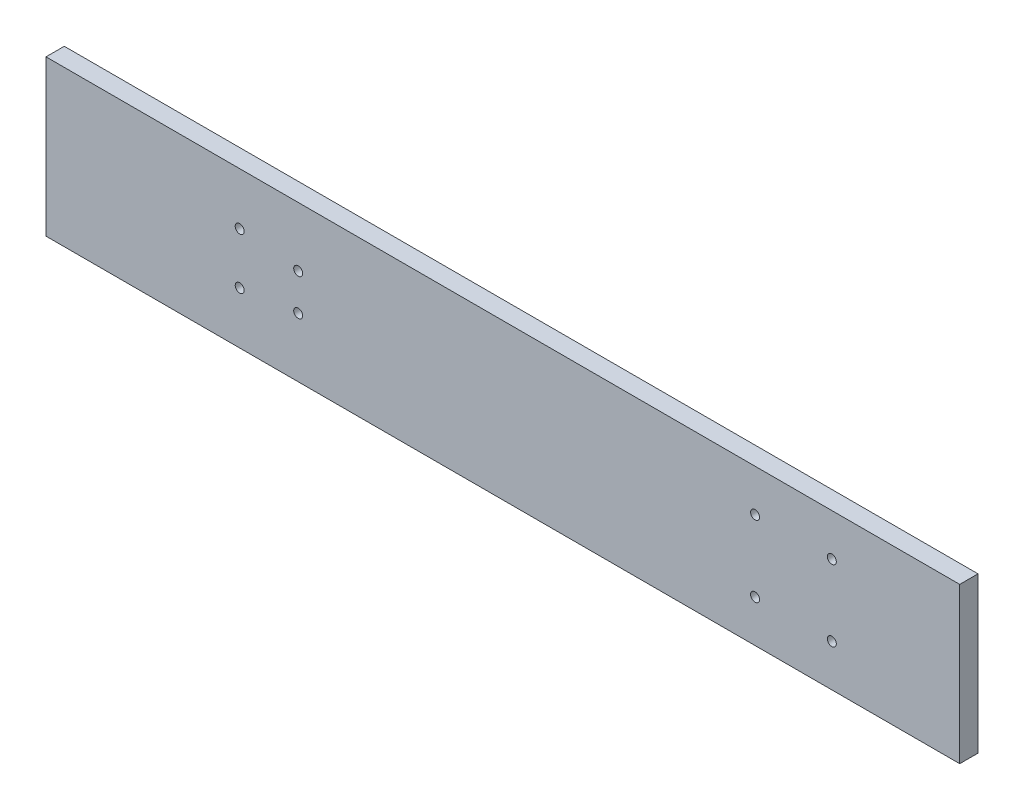
ISO-10303-21;
HEADER;
FILE_DESCRIPTION(('STEP AP214'),'2;1');
FILE_NAME('part.step','',(''),(''),'','','');
FILE_SCHEMA(('AUTOMOTIVE_DESIGN { 1 0 10303 214 1 1 1 1 }'));
ENDSEC;
DATA;
#1=APPLICATION_CONTEXT('core data for automotive mechanical design processes');
#2=APPLICATION_PROTOCOL_DEFINITION('international standard','automotive_design',2000,#1);
#3=PRODUCT_CONTEXT('',#1,'mechanical');
#4=PRODUCT('Part','Part','',(#3));
#5=PRODUCT_RELATED_PRODUCT_CATEGORY('part','',(#4));
#6=PRODUCT_DEFINITION_FORMATION('','',#4);
#7=PRODUCT_DEFINITION_CONTEXT('part definition',#1,'design');
#8=PRODUCT_DEFINITION('design','',#6,#7);
#9=PRODUCT_DEFINITION_SHAPE('','',#8);
#10=(LENGTH_UNIT() NAMED_UNIT(*) SI_UNIT(.MILLI.,.METRE.));
#11=(NAMED_UNIT(*) PLANE_ANGLE_UNIT() SI_UNIT($,.RADIAN.));
#12=(NAMED_UNIT(*) SI_UNIT($,.STERADIAN.) SOLID_ANGLE_UNIT());
#13=UNCERTAINTY_MEASURE_WITH_UNIT(LENGTH_MEASURE(1.E-05),#10,'distance_accuracy_value','');
#14=(GEOMETRIC_REPRESENTATION_CONTEXT(3) GLOBAL_UNCERTAINTY_ASSIGNED_CONTEXT((#13)) GLOBAL_UNIT_ASSIGNED_CONTEXT((#10,
#11,#12)) REPRESENTATION_CONTEXT('',''));
#15=CARTESIAN_POINT('',(0.,0.,0.));
#16=DIRECTION('',(0.,0.,1.));
#17=DIRECTION('',(1.,0.,0.));
#18=AXIS2_PLACEMENT_3D('',#15,#16,#17);
#19=CARTESIAN_POINT('',(250.,42.5,10.));
#20=DIRECTION('',(-1.,0.,0.));
#21=DIRECTION('',(0.,0.,1.));
#22=AXIS2_PLACEMENT_3D('',#19,#20,#21);
#23=PLANE('',#22);
#24=DIRECTION('',(0.,1.,0.));
#25=VECTOR('',#24,1.);
#26=CARTESIAN_POINT('',(250.,42.5,0.));
#27=LINE('',#26,#25);
#28=CARTESIAN_POINT('',(250.,-42.5,0.));
#29=VERTEX_POINT('',#28);
#30=CARTESIAN_POINT('',(250.,42.5,0.));
#31=VERTEX_POINT('',#30);
#32=EDGE_CURVE('E192',#29,#31,#27,.T.);
#33=ORIENTED_EDGE('',*,*,#32,.T.);
#34=DIRECTION('',(0.,0.,-1.));
#35=VECTOR('',#34,1.);
#36=CARTESIAN_POINT('',(250.,42.5,10.));
#37=LINE('',#36,#35);
#38=CARTESIAN_POINT('',(250.,42.5,10.));
#39=VERTEX_POINT('',#38);
#40=EDGE_CURVE('E11',#39,#31,#37,.T.);
#41=ORIENTED_EDGE('',*,*,#40,.F.);
#42=DIRECTION('',(0.,1.,0.));
#43=VECTOR('',#42,1.);
#44=CARTESIAN_POINT('',(250.,42.5,10.));
#45=LINE('',#44,#43);
#46=CARTESIAN_POINT('',(250.,-42.5,10.));
#47=VERTEX_POINT('',#46);
#48=EDGE_CURVE('E193',#47,#39,#45,.T.);
#49=ORIENTED_EDGE('',*,*,#48,.F.);
#50=DIRECTION('',(0.,0.,-1.));
#51=VECTOR('',#50,1.);
#52=CARTESIAN_POINT('',(250.,-42.5,10.));
#53=LINE('',#52,#51);
#54=EDGE_CURVE('E203',#47,#29,#53,.T.);
#55=ORIENTED_EDGE('',*,*,#54,.T.);
#56=EDGE_LOOP('',(#33,#41,#49,#55));
#57=FACE_BOUND('',#56,.T.);
#58=ADVANCED_FACE('F45',(#57),#23,.F.);
#59=CARTESIAN_POINT('',(-250.,42.5,10.));
#60=DIRECTION('',(0.,-1.,0.));
#61=DIRECTION('',(0.,0.,-1.));
#62=AXIS2_PLACEMENT_3D('',#59,#60,#61);
#63=PLANE('',#62);
#64=DIRECTION('',(-1.,0.,0.));
#65=VECTOR('',#64,1.);
#66=CARTESIAN_POINT('',(-250.,42.5,0.));
#67=LINE('',#66,#65);
#68=CARTESIAN_POINT('',(-250.,42.5,0.));
#69=VERTEX_POINT('',#68);
#70=EDGE_CURVE('E207',#31,#69,#67,.T.);
#71=ORIENTED_EDGE('',*,*,#70,.T.);
#72=DIRECTION('',(0.,0.,-1.));
#73=VECTOR('',#72,1.);
#74=CARTESIAN_POINT('',(-250.,42.5,10.));
#75=LINE('',#74,#73);
#76=CARTESIAN_POINT('',(-250.,42.5,10.));
#77=VERTEX_POINT('',#76);
#78=EDGE_CURVE('E54',#77,#69,#75,.T.);
#79=ORIENTED_EDGE('',*,*,#78,.F.);
#80=DIRECTION('',(-1.,0.,0.));
#81=VECTOR('',#80,1.);
#82=CARTESIAN_POINT('',(-250.,42.5,10.));
#83=LINE('',#82,#81);
#84=EDGE_CURVE('E93',#39,#77,#83,.T.);
#85=ORIENTED_EDGE('',*,*,#84,.F.);
#86=ORIENTED_EDGE('',*,*,#40,.T.);
#87=EDGE_LOOP('',(#71,#79,#85,#86));
#88=FACE_BOUND('',#87,.T.);
#89=ADVANCED_FACE('F239',(#88),#63,.F.);
#90=CARTESIAN_POINT('',(-250.,42.5,10.));
#91=DIRECTION('',(1.,0.,0.));
#92=DIRECTION('',(0.,1.,0.));
#93=AXIS2_PLACEMENT_3D('',#90,#91,#92);
#94=PLANE('',#93);
#95=DIRECTION('',(0.,-1.,0.));
#96=VECTOR('',#95,1.);
#97=CARTESIAN_POINT('',(-250.,42.5,0.));
#98=LINE('',#97,#96);
#99=CARTESIAN_POINT('',(-250.,-42.5,0.));
#100=VERTEX_POINT('',#99);
#101=EDGE_CURVE('E80',#69,#100,#98,.T.);
#102=ORIENTED_EDGE('',*,*,#101,.T.);
#103=DIRECTION('',(0.,0.,-1.));
#104=VECTOR('',#103,1.);
#105=CARTESIAN_POINT('',(-250.,-42.5,10.));
#106=LINE('',#105,#104);
#107=CARTESIAN_POINT('',(-250.,-42.5,10.));
#108=VERTEX_POINT('',#107);
#109=EDGE_CURVE('E216',#108,#100,#106,.T.);
#110=ORIENTED_EDGE('',*,*,#109,.F.);
#111=DIRECTION('',(0.,-1.,0.));
#112=VECTOR('',#111,1.);
#113=CARTESIAN_POINT('',(-250.,42.5,10.));
#114=LINE('',#113,#112);
#115=EDGE_CURVE('E198',#77,#108,#114,.T.);
#116=ORIENTED_EDGE('',*,*,#115,.F.);
#117=ORIENTED_EDGE('',*,*,#78,.T.);
#118=EDGE_LOOP('',(#102,#110,#116,#117));
#119=FACE_BOUND('',#118,.T.);
#120=ADVANCED_FACE('F221',(#119),#94,.F.);
#121=CARTESIAN_POINT('',(-250.,-42.5,10.));
#122=DIRECTION('',(0.,1.,0.));
#123=DIRECTION('',(0.,0.,1.));
#124=AXIS2_PLACEMENT_3D('',#121,#122,#123);
#125=PLANE('',#124);
#126=DIRECTION('',(1.,0.,0.));
#127=VECTOR('',#126,1.);
#128=CARTESIAN_POINT('',(-250.,-42.5,0.));
#129=LINE('',#128,#127);
#130=EDGE_CURVE('E86',#100,#29,#129,.T.);
#131=ORIENTED_EDGE('',*,*,#130,.T.);
#132=ORIENTED_EDGE('',*,*,#54,.F.);
#133=DIRECTION('',(1.,0.,0.));
#134=VECTOR('',#133,1.);
#135=CARTESIAN_POINT('',(-250.,-42.5,10.));
#136=LINE('',#135,#134);
#137=EDGE_CURVE('E62',#108,#47,#136,.T.);
#138=ORIENTED_EDGE('',*,*,#137,.F.);
#139=ORIENTED_EDGE('',*,*,#109,.T.);
#140=EDGE_LOOP('',(#131,#132,#138,#139));
#141=FACE_BOUND('',#140,.T.);
#142=ADVANCED_FACE('F228',(#141),#125,.F.);
#143=CARTESIAN_POINT('',(0.,0.,10.));
#144=DIRECTION('',(0.,0.,1.));
#145=DIRECTION('',(1.,0.,0.));
#146=AXIS2_PLACEMENT_3D('',#143,#144,#145);
#147=PLANE('',#146);
#148=CARTESIAN_POINT('',(-144.,14.,10.));
#149=DIRECTION('',(0.,0.,1.));
#150=DIRECTION('',(1.,0.,0.));
#151=AXIS2_PLACEMENT_3D('',#148,#149,#150);
#152=CIRCLE('',#151,2.45745);
#153=CARTESIAN_POINT('',(-141.54255,14.,10.));
#154=VERTEX_POINT('',#153);
#155=EDGE_CURVE('E130',#154,#154,#152,.T.);
#156=ORIENTED_EDGE('',*,*,#155,.F.);
#157=EDGE_LOOP('',(#156));
#158=FACE_BOUND('',#157,.T.);
#159=CARTESIAN_POINT('',(-112.,10.,10.));
#160=DIRECTION('',(0.,0.,1.));
#161=DIRECTION('',(1.,0.,0.));
#162=AXIS2_PLACEMENT_3D('',#159,#160,#161);
#163=CIRCLE('',#162,2.45744999999999);
#164=CARTESIAN_POINT('',(-109.54255,10.,10.));
#165=VERTEX_POINT('',#164);
#166=EDGE_CURVE('E129',#165,#165,#163,.T.);
#167=ORIENTED_EDGE('',*,*,#166,.F.);
#168=EDGE_LOOP('',(#167));
#169=FACE_BOUND('',#168,.T.);
#170=CARTESIAN_POINT('',(-112.,-10.,10.));
#171=DIRECTION('',(0.,0.,1.));
#172=DIRECTION('',(1.,0.,0.));
#173=AXIS2_PLACEMENT_3D('',#170,#171,#172);
#174=CIRCLE('',#173,2.45744999999999);
#175=CARTESIAN_POINT('',(-109.54255,-10.,10.));
#176=VERTEX_POINT('',#175);
#177=EDGE_CURVE('E144',#176,#176,#174,.T.);
#178=ORIENTED_EDGE('',*,*,#177,.F.);
#179=EDGE_LOOP('',(#178));
#180=FACE_BOUND('',#179,.T.);
#181=CARTESIAN_POINT('',(-144.,-14.,10.));
#182=DIRECTION('',(0.,0.,1.));
#183=DIRECTION('',(1.,0.,0.));
#184=AXIS2_PLACEMENT_3D('',#181,#182,#183);
#185=CIRCLE('',#184,2.45745);
#186=CARTESIAN_POINT('',(-141.54255,-14.,10.));
#187=VERTEX_POINT('',#186);
#188=EDGE_CURVE('E152',#187,#187,#185,.T.);
#189=ORIENTED_EDGE('',*,*,#188,.F.);
#190=EDGE_LOOP('',(#189));
#191=FACE_BOUND('',#190,.T.);
#192=CARTESIAN_POINT('',(180.,19.5,10.));
#193=DIRECTION('',(0.,0.,1.));
#194=DIRECTION('',(1.,0.,0.));
#195=AXIS2_PLACEMENT_3D('',#192,#193,#194);
#196=CIRCLE('',#195,2.45745);
#197=CARTESIAN_POINT('',(182.45745,19.5,10.));
#198=VERTEX_POINT('',#197);
#199=EDGE_CURVE('E160',#198,#198,#196,.T.);
#200=ORIENTED_EDGE('',*,*,#199,.F.);
#201=EDGE_LOOP('',(#200));
#202=FACE_BOUND('',#201,.T.);
#203=CARTESIAN_POINT('',(180.,-19.5,10.));
#204=DIRECTION('',(0.,0.,1.));
#205=DIRECTION('',(1.,0.,0.));
#206=AXIS2_PLACEMENT_3D('',#203,#204,#205);
#207=CIRCLE('',#206,2.45745);
#208=CARTESIAN_POINT('',(182.45745,-19.5,10.));
#209=VERTEX_POINT('',#208);
#210=EDGE_CURVE('E168',#209,#209,#207,.T.);
#211=ORIENTED_EDGE('',*,*,#210,.F.);
#212=EDGE_LOOP('',(#211));
#213=FACE_BOUND('',#212,.T.);
#214=CARTESIAN_POINT('',(138.,-19.5,10.));
#215=DIRECTION('',(0.,0.,1.));
#216=DIRECTION('',(1.,0.,0.));
#217=AXIS2_PLACEMENT_3D('',#214,#215,#216);
#218=CIRCLE('',#217,2.45745);
#219=CARTESIAN_POINT('',(140.45745,-19.5,10.));
#220=VERTEX_POINT('',#219);
#221=EDGE_CURVE('E176',#220,#220,#218,.T.);
#222=ORIENTED_EDGE('',*,*,#221,.F.);
#223=EDGE_LOOP('',(#222));
#224=FACE_BOUND('',#223,.T.);
#225=CARTESIAN_POINT('',(138.,19.5,10.));
#226=DIRECTION('',(0.,0.,1.));
#227=DIRECTION('',(1.,0.,0.));
#228=AXIS2_PLACEMENT_3D('',#225,#226,#227);
#229=CIRCLE('',#228,2.45745);
#230=CARTESIAN_POINT('',(140.45745,19.5,10.));
#231=VERTEX_POINT('',#230);
#232=EDGE_CURVE('E184',#231,#231,#229,.T.);
#233=ORIENTED_EDGE('',*,*,#232,.F.);
#234=EDGE_LOOP('',(#233));
#235=FACE_BOUND('',#234,.T.);
#236=ORIENTED_EDGE('',*,*,#48,.T.);
#237=ORIENTED_EDGE('',*,*,#84,.T.);
#238=ORIENTED_EDGE('',*,*,#115,.T.);
#239=ORIENTED_EDGE('',*,*,#137,.T.);
#240=EDGE_LOOP('',(#236,#237,#238,#239));
#241=FACE_BOUND('',#240,.T.);
#242=ADVANCED_FACE('F230',(#158,#169,#180,#191,#202,#213,#224,#235,#241),#147,.T.);
#243=CARTESIAN_POINT('',(0.,0.,0.));
#244=DIRECTION('',(0.,0.,1.));
#245=DIRECTION('',(1.,0.,0.));
#246=AXIS2_PLACEMENT_3D('',#243,#244,#245);
#247=PLANE('',#246);
#248=ORIENTED_EDGE('',*,*,#32,.F.);
#249=ORIENTED_EDGE('',*,*,#130,.F.);
#250=ORIENTED_EDGE('',*,*,#101,.F.);
#251=ORIENTED_EDGE('',*,*,#70,.F.);
#252=EDGE_LOOP('',(#248,#249,#250,#251));
#253=FACE_BOUND('',#252,.T.);
#254=ADVANCED_FACE('F224',(#253),#247,.F.);
#255=CARTESIAN_POINT('',(138.,19.5,5.));
#256=DIRECTION('',(0.,0.,1.));
#257=DIRECTION('',(1.,0.,0.));
#258=AXIS2_PLACEMENT_3D('',#255,#256,#257);
#259=CONICAL_SURFACE('',#258,2.45745,1.02974425867665);
#260=CARTESIAN_POINT('',(138.,19.5,3.52341507177072));
#261=VERTEX_POINT('',#260);
#262=VERTEX_LOOP('',#261);
#263=FACE_BOUND('',#262,.T.);
#264=CARTESIAN_POINT('',(138.,19.5,5.));
#265=DIRECTION('',(0.,0.,1.));
#266=DIRECTION('',(1.,0.,0.));
#267=AXIS2_PLACEMENT_3D('',#264,#265,#266);
#268=CIRCLE('',#267,2.45745);
#269=CARTESIAN_POINT('',(140.45745,19.5,5.));
#270=VERTEX_POINT('',#269);
#271=EDGE_CURVE('E188',#270,#270,#268,.T.);
#272=ORIENTED_EDGE('',*,*,#271,.T.);
#273=EDGE_LOOP('',(#272));
#274=FACE_BOUND('',#273,.T.);
#275=ADVANCED_FACE('F274',(#263,#274),#259,.F.);
#276=CARTESIAN_POINT('',(138.,19.5,10.));
#277=DIRECTION('',(0.,0.,1.));
#278=DIRECTION('',(1.,0.,0.));
#279=AXIS2_PLACEMENT_3D('',#276,#277,#278);
#280=CYLINDRICAL_SURFACE('',#279,2.45745);
#281=ORIENTED_EDGE('',*,*,#271,.F.);
#282=EDGE_LOOP('',(#281));
#283=FACE_BOUND('',#282,.T.);
#284=ORIENTED_EDGE('',*,*,#232,.T.);
#285=EDGE_LOOP('',(#284));
#286=FACE_BOUND('',#285,.T.);
#287=ADVANCED_FACE('F282',(#283,#286),#280,.F.);
#288=CARTESIAN_POINT('',(138.,-19.5,5.));
#289=DIRECTION('',(0.,0.,1.));
#290=DIRECTION('',(1.,0.,0.));
#291=AXIS2_PLACEMENT_3D('',#288,#289,#290);
#292=CONICAL_SURFACE('',#291,2.45745,1.02974425867665);
#293=CARTESIAN_POINT('',(138.,-19.5,3.52341507177072));
#294=VERTEX_POINT('',#293);
#295=VERTEX_LOOP('',#294);
#296=FACE_BOUND('',#295,.T.);
#297=CARTESIAN_POINT('',(138.,-19.5,5.));
#298=DIRECTION('',(0.,0.,1.));
#299=DIRECTION('',(1.,0.,0.));
#300=AXIS2_PLACEMENT_3D('',#297,#298,#299);
#301=CIRCLE('',#300,2.45745);
#302=CARTESIAN_POINT('',(140.45745,-19.5,5.));
#303=VERTEX_POINT('',#302);
#304=EDGE_CURVE('E180',#303,#303,#301,.T.);
#305=ORIENTED_EDGE('',*,*,#304,.T.);
#306=EDGE_LOOP('',(#305));
#307=FACE_BOUND('',#306,.T.);
#308=ADVANCED_FACE('F292',(#296,#307),#292,.F.);
#309=CARTESIAN_POINT('',(138.,-19.5,10.));
#310=DIRECTION('',(0.,0.,1.));
#311=DIRECTION('',(1.,0.,0.));
#312=AXIS2_PLACEMENT_3D('',#309,#310,#311);
#313=CYLINDRICAL_SURFACE('',#312,2.45745);
#314=ORIENTED_EDGE('',*,*,#304,.F.);
#315=EDGE_LOOP('',(#314));
#316=FACE_BOUND('',#315,.T.);
#317=ORIENTED_EDGE('',*,*,#221,.T.);
#318=EDGE_LOOP('',(#317));
#319=FACE_BOUND('',#318,.T.);
#320=ADVANCED_FACE('F302',(#316,#319),#313,.F.);
#321=CARTESIAN_POINT('',(180.,-19.5,5.));
#322=DIRECTION('',(0.,0.,1.));
#323=DIRECTION('',(1.,0.,0.));
#324=AXIS2_PLACEMENT_3D('',#321,#322,#323);
#325=CONICAL_SURFACE('',#324,2.45745,1.02974425867665);
#326=CARTESIAN_POINT('',(180.,-19.5,3.52341507177072));
#327=VERTEX_POINT('',#326);
#328=VERTEX_LOOP('',#327);
#329=FACE_BOUND('',#328,.T.);
#330=CARTESIAN_POINT('',(180.,-19.5,5.));
#331=DIRECTION('',(0.,0.,1.));
#332=DIRECTION('',(1.,0.,0.));
#333=AXIS2_PLACEMENT_3D('',#330,#331,#332);
#334=CIRCLE('',#333,2.45745);
#335=CARTESIAN_POINT('',(182.45745,-19.5,5.));
#336=VERTEX_POINT('',#335);
#337=EDGE_CURVE('E172',#336,#336,#334,.T.);
#338=ORIENTED_EDGE('',*,*,#337,.T.);
#339=EDGE_LOOP('',(#338));
#340=FACE_BOUND('',#339,.T.);
#341=ADVANCED_FACE('F312',(#329,#340),#325,.F.);
#342=CARTESIAN_POINT('',(180.,-19.5,10.));
#343=DIRECTION('',(0.,0.,1.));
#344=DIRECTION('',(1.,0.,0.));
#345=AXIS2_PLACEMENT_3D('',#342,#343,#344);
#346=CYLINDRICAL_SURFACE('',#345,2.45745);
#347=ORIENTED_EDGE('',*,*,#337,.F.);
#348=EDGE_LOOP('',(#347));
#349=FACE_BOUND('',#348,.T.);
#350=ORIENTED_EDGE('',*,*,#210,.T.);
#351=EDGE_LOOP('',(#350));
#352=FACE_BOUND('',#351,.T.);
#353=ADVANCED_FACE('F322',(#349,#352),#346,.F.);
#354=CARTESIAN_POINT('',(180.,19.5,5.));
#355=DIRECTION('',(0.,0.,1.));
#356=DIRECTION('',(1.,0.,0.));
#357=AXIS2_PLACEMENT_3D('',#354,#355,#356);
#358=CONICAL_SURFACE('',#357,2.45745,1.02974425867665);
#359=CARTESIAN_POINT('',(180.,19.5,3.52341507177072));
#360=VERTEX_POINT('',#359);
#361=VERTEX_LOOP('',#360);
#362=FACE_BOUND('',#361,.T.);
#363=CARTESIAN_POINT('',(180.,19.5,5.));
#364=DIRECTION('',(0.,0.,1.));
#365=DIRECTION('',(1.,0.,0.));
#366=AXIS2_PLACEMENT_3D('',#363,#364,#365);
#367=CIRCLE('',#366,2.45745);
#368=CARTESIAN_POINT('',(182.45745,19.5,5.));
#369=VERTEX_POINT('',#368);
#370=EDGE_CURVE('E164',#369,#369,#367,.T.);
#371=ORIENTED_EDGE('',*,*,#370,.T.);
#372=EDGE_LOOP('',(#371));
#373=FACE_BOUND('',#372,.T.);
#374=ADVANCED_FACE('F332',(#362,#373),#358,.F.);
#375=CARTESIAN_POINT('',(180.,19.5,10.));
#376=DIRECTION('',(0.,0.,1.));
#377=DIRECTION('',(1.,0.,0.));
#378=AXIS2_PLACEMENT_3D('',#375,#376,#377);
#379=CYLINDRICAL_SURFACE('',#378,2.45745);
#380=ORIENTED_EDGE('',*,*,#370,.F.);
#381=EDGE_LOOP('',(#380));
#382=FACE_BOUND('',#381,.T.);
#383=ORIENTED_EDGE('',*,*,#199,.T.);
#384=EDGE_LOOP('',(#383));
#385=FACE_BOUND('',#384,.T.);
#386=ADVANCED_FACE('F342',(#382,#385),#379,.F.);
#387=CARTESIAN_POINT('',(-144.,-14.,5.));
#388=DIRECTION('',(0.,0.,1.));
#389=DIRECTION('',(1.,0.,0.));
#390=AXIS2_PLACEMENT_3D('',#387,#388,#389);
#391=CONICAL_SURFACE('',#390,2.45745,1.02974425867666);
#392=CARTESIAN_POINT('',(-144.,-14.,3.52341507177072));
#393=VERTEX_POINT('',#392);
#394=VERTEX_LOOP('',#393);
#395=FACE_BOUND('',#394,.T.);
#396=CARTESIAN_POINT('',(-144.,-14.,5.));
#397=DIRECTION('',(0.,0.,1.));
#398=DIRECTION('',(1.,0.,0.));
#399=AXIS2_PLACEMENT_3D('',#396,#397,#398);
#400=CIRCLE('',#399,2.45745);
#401=CARTESIAN_POINT('',(-141.54255,-14.,5.));
#402=VERTEX_POINT('',#401);
#403=EDGE_CURVE('E156',#402,#402,#400,.T.);
#404=ORIENTED_EDGE('',*,*,#403,.T.);
#405=EDGE_LOOP('',(#404));
#406=FACE_BOUND('',#405,.T.);
#407=ADVANCED_FACE('F351',(#395,#406),#391,.F.);
#408=CARTESIAN_POINT('',(-144.,-14.,10.));
#409=DIRECTION('',(0.,0.,1.));
#410=DIRECTION('',(1.,0.,0.));
#411=AXIS2_PLACEMENT_3D('',#408,#409,#410);
#412=CYLINDRICAL_SURFACE('',#411,2.45745);
#413=ORIENTED_EDGE('',*,*,#403,.F.);
#414=EDGE_LOOP('',(#413));
#415=FACE_BOUND('',#414,.T.);
#416=ORIENTED_EDGE('',*,*,#188,.T.);
#417=EDGE_LOOP('',(#416));
#418=FACE_BOUND('',#417,.T.);
#419=ADVANCED_FACE('F360',(#415,#418),#412,.F.);
#420=CARTESIAN_POINT('',(-112.,-10.,5.));
#421=DIRECTION('',(0.,0.,1.));
#422=DIRECTION('',(1.,0.,0.));
#423=AXIS2_PLACEMENT_3D('',#420,#421,#422);
#424=CONICAL_SURFACE('',#423,2.45744999999999,1.02974425867665);
#425=CARTESIAN_POINT('',(-112.,-10.,3.52341507177072));
#426=VERTEX_POINT('',#425);
#427=VERTEX_LOOP('',#426);
#428=FACE_BOUND('',#427,.T.);
#429=CARTESIAN_POINT('',(-112.,-10.,5.));
#430=DIRECTION('',(0.,0.,1.));
#431=DIRECTION('',(1.,0.,0.));
#432=AXIS2_PLACEMENT_3D('',#429,#430,#431);
#433=CIRCLE('',#432,2.45744999999999);
#434=CARTESIAN_POINT('',(-109.54255,-10.,5.));
#435=VERTEX_POINT('',#434);
#436=EDGE_CURVE('E148',#435,#435,#433,.T.);
#437=ORIENTED_EDGE('',*,*,#436,.T.);
#438=EDGE_LOOP('',(#437));
#439=FACE_BOUND('',#438,.T.);
#440=ADVANCED_FACE('F370',(#428,#439),#424,.F.);
#441=CARTESIAN_POINT('',(-112.,-10.,10.));
#442=DIRECTION('',(0.,0.,1.));
#443=DIRECTION('',(1.,0.,0.));
#444=AXIS2_PLACEMENT_3D('',#441,#442,#443);
#445=CYLINDRICAL_SURFACE('',#444,2.45744999999999);
#446=ORIENTED_EDGE('',*,*,#436,.F.);
#447=EDGE_LOOP('',(#446));
#448=FACE_BOUND('',#447,.T.);
#449=ORIENTED_EDGE('',*,*,#177,.T.);
#450=EDGE_LOOP('',(#449));
#451=FACE_BOUND('',#450,.T.);
#452=ADVANCED_FACE('F380',(#448,#451),#445,.F.);
#453=CARTESIAN_POINT('',(-112.,10.,5.));
#454=DIRECTION('',(0.,0.,1.));
#455=DIRECTION('',(1.,0.,0.));
#456=AXIS2_PLACEMENT_3D('',#453,#454,#455);
#457=CONICAL_SURFACE('',#456,2.45744999999999,1.02974425867665);
#458=CARTESIAN_POINT('',(-112.,10.,3.52341507177072));
#459=VERTEX_POINT('',#458);
#460=VERTEX_LOOP('',#459);
#461=FACE_BOUND('',#460,.T.);
#462=CARTESIAN_POINT('',(-112.,10.,5.));
#463=DIRECTION('',(0.,0.,1.));
#464=DIRECTION('',(1.,0.,0.));
#465=AXIS2_PLACEMENT_3D('',#462,#463,#464);
#466=CIRCLE('',#465,2.45744999999999);
#467=CARTESIAN_POINT('',(-109.54255,10.,5.));
#468=VERTEX_POINT('',#467);
#469=EDGE_CURVE('E136',#468,#468,#466,.T.);
#470=ORIENTED_EDGE('',*,*,#469,.T.);
#471=EDGE_LOOP('',(#470));
#472=FACE_BOUND('',#471,.T.);
#473=ADVANCED_FACE('F390',(#461,#472),#457,.F.);
#474=CARTESIAN_POINT('',(-112.,10.,10.));
#475=DIRECTION('',(0.,0.,1.));
#476=DIRECTION('',(1.,0.,0.));
#477=AXIS2_PLACEMENT_3D('',#474,#475,#476);
#478=CYLINDRICAL_SURFACE('',#477,2.45744999999999);
#479=ORIENTED_EDGE('',*,*,#469,.F.);
#480=EDGE_LOOP('',(#479));
#481=FACE_BOUND('',#480,.T.);
#482=ORIENTED_EDGE('',*,*,#166,.T.);
#483=EDGE_LOOP('',(#482));
#484=FACE_BOUND('',#483,.T.);
#485=ADVANCED_FACE('F122',(#481,#484),#478,.F.);
#486=CARTESIAN_POINT('',(-144.,14.,5.));
#487=DIRECTION('',(0.,0.,1.));
#488=DIRECTION('',(1.,0.,0.));
#489=AXIS2_PLACEMENT_3D('',#486,#487,#488);
#490=CONICAL_SURFACE('',#489,2.45745,1.02974425867666);
#491=CARTESIAN_POINT('',(-144.,14.,3.52341507177072));
#492=VERTEX_POINT('',#491);
#493=VERTEX_LOOP('',#492);
#494=FACE_BOUND('',#493,.T.);
#495=CARTESIAN_POINT('',(-144.,14.,5.));
#496=DIRECTION('',(0.,0.,1.));
#497=DIRECTION('',(1.,0.,0.));
#498=AXIS2_PLACEMENT_3D('',#495,#496,#497);
#499=CIRCLE('',#498,2.45745);
#500=CARTESIAN_POINT('',(-141.54255,14.,5.));
#501=VERTEX_POINT('',#500);
#502=EDGE_CURVE('E126',#501,#501,#499,.T.);
#503=ORIENTED_EDGE('',*,*,#502,.T.);
#504=EDGE_LOOP('',(#503));
#505=FACE_BOUND('',#504,.T.);
#506=ADVANCED_FACE('F118',(#494,#505),#490,.F.);
#507=CARTESIAN_POINT('',(-144.,14.,10.));
#508=DIRECTION('',(0.,0.,1.));
#509=DIRECTION('',(1.,0.,0.));
#510=AXIS2_PLACEMENT_3D('',#507,#508,#509);
#511=CYLINDRICAL_SURFACE('',#510,2.45745);
#512=ORIENTED_EDGE('',*,*,#502,.F.);
#513=EDGE_LOOP('',(#512));
#514=FACE_BOUND('',#513,.T.);
#515=ORIENTED_EDGE('',*,*,#155,.T.);
#516=EDGE_LOOP('',(#515));
#517=FACE_BOUND('',#516,.T.);
#518=ADVANCED_FACE('F121',(#514,#517),#511,.F.);
#519=CLOSED_SHELL('',(#58,#89,#120,#142,#242,#254,#275,#287,#308,#320,#341,#353,#374,#386,#407,
#419,#440,#452,#473,#485,#506,#518));
#520=MANIFOLD_SOLID_BREP('B2',#519);
#521=ADVANCED_BREP_SHAPE_REPRESENTATION('',(#18,#520),#14);
#522=SHAPE_DEFINITION_REPRESENTATION(#9,#521);
ENDSEC;
END-ISO-10303-21;
